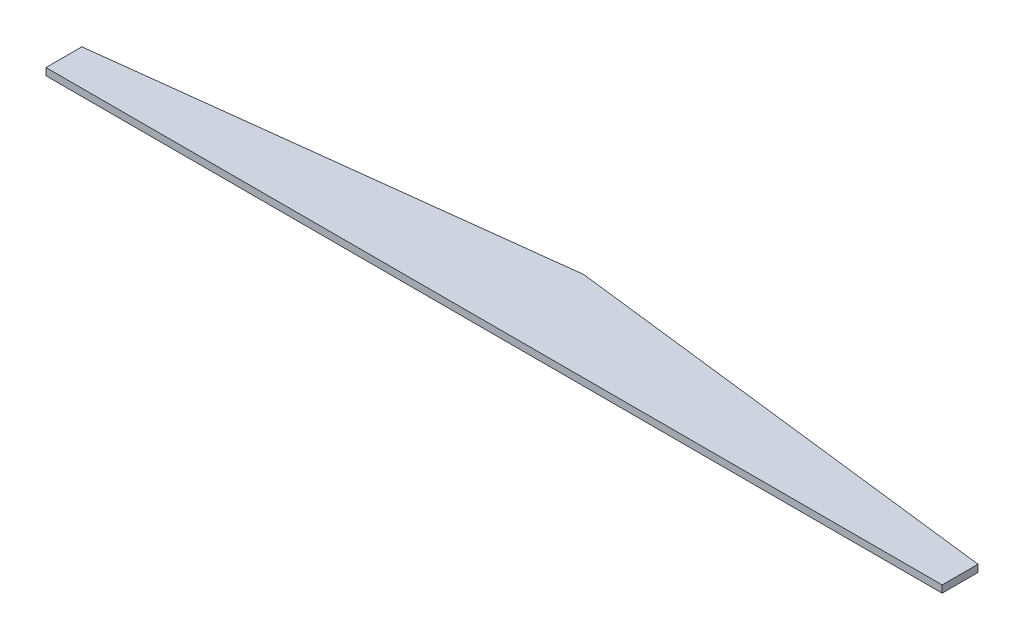
ISO-10303-21;
HEADER;
FILE_DESCRIPTION(('STEP AP214'),'2;1');
FILE_NAME('part.step','',(''),(''),'','','');
FILE_SCHEMA(('AUTOMOTIVE_DESIGN { 1 0 10303 214 1 1 1 1 }'));
ENDSEC;
DATA;
#1=APPLICATION_CONTEXT('core data for automotive mechanical design processes');
#2=APPLICATION_PROTOCOL_DEFINITION('international standard','automotive_design',2000,#1);
#3=PRODUCT_CONTEXT('',#1,'mechanical');
#4=PRODUCT('Part','Part','',(#3));
#5=PRODUCT_RELATED_PRODUCT_CATEGORY('part','',(#4));
#6=PRODUCT_DEFINITION_FORMATION('','',#4);
#7=PRODUCT_DEFINITION_CONTEXT('part definition',#1,'design');
#8=PRODUCT_DEFINITION('design','',#6,#7);
#9=PRODUCT_DEFINITION_SHAPE('','',#8);
#10=(LENGTH_UNIT() NAMED_UNIT(*) SI_UNIT(.MILLI.,.METRE.));
#11=(NAMED_UNIT(*) PLANE_ANGLE_UNIT() SI_UNIT($,.RADIAN.));
#12=(NAMED_UNIT(*) SI_UNIT($,.STERADIAN.) SOLID_ANGLE_UNIT());
#13=UNCERTAINTY_MEASURE_WITH_UNIT(LENGTH_MEASURE(1.E-05),#10,'distance_accuracy_value','');
#14=(GEOMETRIC_REPRESENTATION_CONTEXT(3) GLOBAL_UNCERTAINTY_ASSIGNED_CONTEXT((#13)) GLOBAL_UNIT_ASSIGNED_CONTEXT((#10,
#11,#12)) REPRESENTATION_CONTEXT('',''));
#15=CARTESIAN_POINT('',(0.,0.,0.));
#16=DIRECTION('',(0.,0.,1.));
#17=DIRECTION('',(1.,0.,0.));
#18=AXIS2_PLACEMENT_3D('',#15,#16,#17);
#19=CARTESIAN_POINT('',(0.,8.,0.));
#20=DIRECTION('',(0.,0.,-1.));
#21=DIRECTION('',(-1.,0.,0.));
#22=AXIS2_PLACEMENT_3D('',#19,#20,#21);
#23=PLANE('',#22);
#24=DIRECTION('',(1.,0.,0.));
#25=VECTOR('',#24,1.);
#26=CARTESIAN_POINT('',(0.,0.,0.));
#27=LINE('',#26,#25);
#28=CARTESIAN_POINT('',(-500.,0.,0.));
#29=VERTEX_POINT('',#28);
#30=CARTESIAN_POINT('',(500.,0.,0.));
#31=VERTEX_POINT('',#30);
#32=EDGE_CURVE('E78',#29,#31,#27,.T.);
#33=ORIENTED_EDGE('',*,*,#32,.T.);
#34=DIRECTION('',(0.,-1.,0.));
#35=VECTOR('',#34,1.);
#36=CARTESIAN_POINT('',(500.,8.,0.));
#37=LINE('',#36,#35);
#38=CARTESIAN_POINT('',(500.,8.,0.));
#39=VERTEX_POINT('',#38);
#40=EDGE_CURVE('E11',#39,#31,#37,.T.);
#41=ORIENTED_EDGE('',*,*,#40,.F.);
#42=DIRECTION('',(1.,0.,0.));
#43=VECTOR('',#42,1.);
#44=CARTESIAN_POINT('',(-500.,8.,0.));
#45=LINE('',#44,#43);
#46=CARTESIAN_POINT('',(-500.,8.,0.));
#47=VERTEX_POINT('',#46);
#48=EDGE_CURVE('E84',#47,#39,#45,.T.);
#49=ORIENTED_EDGE('',*,*,#48,.F.);
#50=DIRECTION('',(0.,-1.,0.));
#51=VECTOR('',#50,1.);
#52=CARTESIAN_POINT('',(-500.,8.,0.));
#53=LINE('',#52,#51);
#54=EDGE_CURVE('E108',#47,#29,#53,.T.);
#55=ORIENTED_EDGE('',*,*,#54,.T.);
#56=EDGE_LOOP('',(#33,#41,#49,#55));
#57=FACE_BOUND('',#56,.T.);
#58=ADVANCED_FACE('F35',(#57),#23,.F.);
#59=CARTESIAN_POINT('',(500.,8.,0.));
#60=DIRECTION('',(-1.,0.,0.));
#61=DIRECTION('',(0.,0.,1.));
#62=AXIS2_PLACEMENT_3D('',#59,#60,#61);
#63=PLANE('',#62);
#64=DIRECTION('',(0.,0.,-1.));
#65=VECTOR('',#64,1.);
#66=CARTESIAN_POINT('',(500.,0.,0.));
#67=LINE('',#66,#65);
#68=CARTESIAN_POINT('',(500.,0.,-40.));
#69=VERTEX_POINT('',#68);
#70=EDGE_CURVE('E113',#31,#69,#67,.T.);
#71=ORIENTED_EDGE('',*,*,#70,.T.);
#72=DIRECTION('',(0.,-1.,0.));
#73=VECTOR('',#72,1.);
#74=CARTESIAN_POINT('',(500.,8.,-40.));
#75=LINE('',#74,#73);
#76=CARTESIAN_POINT('',(500.,8.,-40.));
#77=VERTEX_POINT('',#76);
#78=EDGE_CURVE('E43',#77,#69,#75,.T.);
#79=ORIENTED_EDGE('',*,*,#78,.F.);
#80=DIRECTION('',(0.,0.,-1.));
#81=VECTOR('',#80,1.);
#82=CARTESIAN_POINT('',(500.,8.,0.));
#83=LINE('',#82,#81);
#84=EDGE_CURVE('E95',#39,#77,#83,.T.);
#85=ORIENTED_EDGE('',*,*,#84,.F.);
#86=ORIENTED_EDGE('',*,*,#40,.T.);
#87=EDGE_LOOP('',(#71,#79,#85,#86));
#88=FACE_BOUND('',#87,.T.);
#89=ADVANCED_FACE('F127',(#88),#63,.F.);
#90=CARTESIAN_POINT('',(0.,8.,-100.));
#91=DIRECTION('',(-0.119145220618431,0.,0.992876838486922));
#92=DIRECTION('',(0.992876838486922,0.,0.119145220618431));
#93=AXIS2_PLACEMENT_3D('',#90,#91,#92);
#94=PLANE('',#93);
#95=DIRECTION('',(-0.992876838486922,0.,-0.119145220618431));
#96=VECTOR('',#95,1.);
#97=CARTESIAN_POINT('',(0.,0.,-100.));
#98=LINE('',#97,#96);
#99=CARTESIAN_POINT('',(0.,0.,-100.));
#100=VERTEX_POINT('',#99);
#101=EDGE_CURVE('E103',#69,#100,#98,.T.);
#102=ORIENTED_EDGE('',*,*,#101,.T.);
#103=DIRECTION('',(0.,-1.,0.));
#104=VECTOR('',#103,1.);
#105=CARTESIAN_POINT('',(0.,8.,-100.));
#106=LINE('',#105,#104);
#107=CARTESIAN_POINT('',(0.,8.,-100.));
#108=VERTEX_POINT('',#107);
#109=EDGE_CURVE('E100',#108,#100,#106,.T.);
#110=ORIENTED_EDGE('',*,*,#109,.F.);
#111=DIRECTION('',(-0.992876838486922,0.,-0.119145220618431));
#112=VECTOR('',#111,1.);
#113=CARTESIAN_POINT('',(0.,8.,-100.));
#114=LINE('',#113,#112);
#115=EDGE_CURVE('E89',#77,#108,#114,.T.);
#116=ORIENTED_EDGE('',*,*,#115,.F.);
#117=ORIENTED_EDGE('',*,*,#78,.T.);
#118=EDGE_LOOP('',(#102,#110,#116,#117));
#119=FACE_BOUND('',#118,.T.);
#120=ADVANCED_FACE('F101',(#119),#94,.F.);
#121=CARTESIAN_POINT('',(0.,8.,-100.));
#122=DIRECTION('',(0.119145220618431,0.,0.992876838486922));
#123=DIRECTION('',(0.992876838486922,0.,-0.119145220618431));
#124=AXIS2_PLACEMENT_3D('',#121,#122,#123);
#125=PLANE('',#124);
#126=DIRECTION('',(-0.992876838486922,0.,0.119145220618431));
#127=VECTOR('',#126,1.);
#128=CARTESIAN_POINT('',(0.,0.,-100.));
#129=LINE('',#128,#127);
#130=CARTESIAN_POINT('',(-500.,0.,-40.));
#131=VERTEX_POINT('',#130);
#132=EDGE_CURVE('E71',#100,#131,#129,.T.);
#133=ORIENTED_EDGE('',*,*,#132,.T.);
#134=DIRECTION('',(0.,-1.,0.));
#135=VECTOR('',#134,1.);
#136=CARTESIAN_POINT('',(-500.,8.,-40.));
#137=LINE('',#136,#135);
#138=CARTESIAN_POINT('',(-500.,8.,-40.));
#139=VERTEX_POINT('',#138);
#140=EDGE_CURVE('E104',#139,#131,#137,.T.);
#141=ORIENTED_EDGE('',*,*,#140,.F.);
#142=DIRECTION('',(-0.992876838486922,0.,0.119145220618431));
#143=VECTOR('',#142,1.);
#144=CARTESIAN_POINT('',(0.,8.,-100.));
#145=LINE('',#144,#143);
#146=EDGE_CURVE('E93',#108,#139,#145,.T.);
#147=ORIENTED_EDGE('',*,*,#146,.F.);
#148=ORIENTED_EDGE('',*,*,#109,.T.);
#149=EDGE_LOOP('',(#133,#141,#147,#148));
#150=FACE_BOUND('',#149,.T.);
#151=ADVANCED_FACE('F106',(#150),#125,.F.);
#152=CARTESIAN_POINT('',(-500.,8.,-40.));
#153=DIRECTION('',(1.,0.,0.));
#154=DIRECTION('',(0.,0.,-1.));
#155=AXIS2_PLACEMENT_3D('',#152,#153,#154);
#156=PLANE('',#155);
#157=DIRECTION('',(0.,0.,1.));
#158=VECTOR('',#157,1.);
#159=CARTESIAN_POINT('',(-500.,0.,-40.));
#160=LINE('',#159,#158);
#161=EDGE_CURVE('E117',#131,#29,#160,.T.);
#162=ORIENTED_EDGE('',*,*,#161,.T.);
#163=ORIENTED_EDGE('',*,*,#54,.F.);
#164=DIRECTION('',(0.,0.,1.));
#165=VECTOR('',#164,1.);
#166=CARTESIAN_POINT('',(-500.,8.,-40.));
#167=LINE('',#166,#165);
#168=EDGE_CURVE('E51',#139,#47,#167,.T.);
#169=ORIENTED_EDGE('',*,*,#168,.F.);
#170=ORIENTED_EDGE('',*,*,#140,.T.);
#171=EDGE_LOOP('',(#162,#163,#169,#170));
#172=FACE_BOUND('',#171,.T.);
#173=ADVANCED_FACE('F124',(#172),#156,.F.);
#174=CARTESIAN_POINT('',(0.,8.,0.));
#175=DIRECTION('',(0.,1.,0.));
#176=DIRECTION('',(0.,0.,1.));
#177=AXIS2_PLACEMENT_3D('',#174,#175,#176);
#178=PLANE('',#177);
#179=ORIENTED_EDGE('',*,*,#48,.T.);
#180=ORIENTED_EDGE('',*,*,#84,.T.);
#181=ORIENTED_EDGE('',*,*,#115,.T.);
#182=ORIENTED_EDGE('',*,*,#146,.T.);
#183=ORIENTED_EDGE('',*,*,#168,.T.);
#184=EDGE_LOOP('',(#179,#180,#181,#182,#183));
#185=FACE_BOUND('',#184,.T.);
#186=ADVANCED_FACE('F91',(#185),#178,.T.);
#187=CARTESIAN_POINT('',(0.,0.,0.));
#188=DIRECTION('',(0.,1.,0.));
#189=DIRECTION('',(0.,0.,1.));
#190=AXIS2_PLACEMENT_3D('',#187,#188,#189);
#191=PLANE('',#190);
#192=ORIENTED_EDGE('',*,*,#32,.F.);
#193=ORIENTED_EDGE('',*,*,#161,.F.);
#194=ORIENTED_EDGE('',*,*,#132,.F.);
#195=ORIENTED_EDGE('',*,*,#101,.F.);
#196=ORIENTED_EDGE('',*,*,#70,.F.);
#197=EDGE_LOOP('',(#192,#193,#194,#195,#196));
#198=FACE_BOUND('',#197,.T.);
#199=ADVANCED_FACE('F122',(#198),#191,.F.);
#200=CLOSED_SHELL('',(#58,#89,#120,#151,#173,#186,#199));
#201=MANIFOLD_SOLID_BREP('B2',#200);
#202=ADVANCED_BREP_SHAPE_REPRESENTATION('',(#18,#201),#14);
#203=SHAPE_DEFINITION_REPRESENTATION(#9,#202);
ENDSEC;
END-ISO-10303-21;
